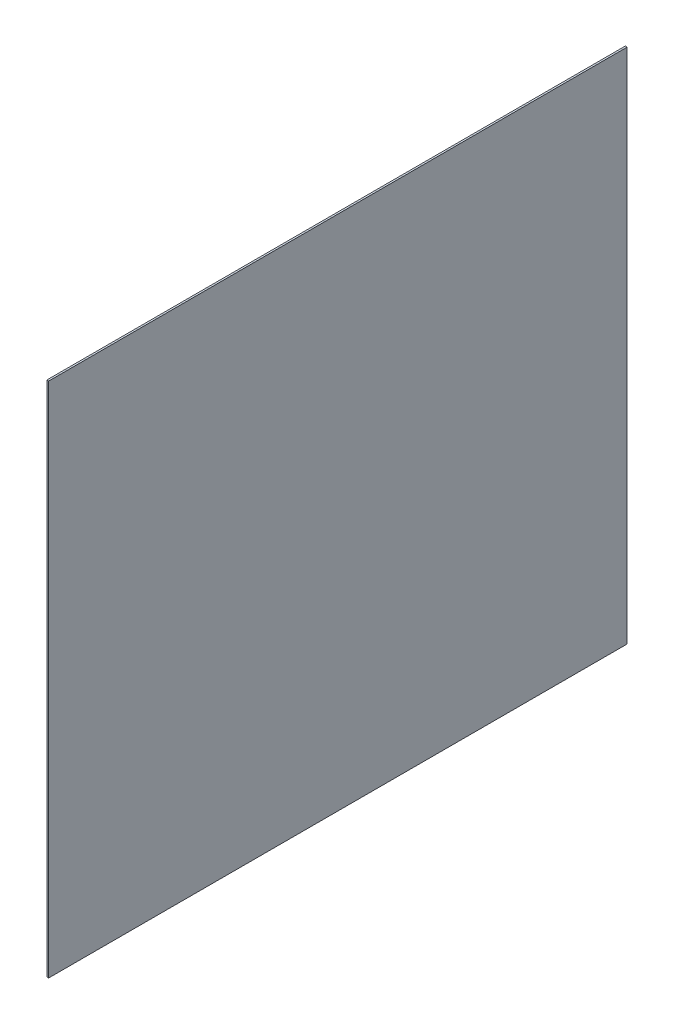
ISO-10303-21;
HEADER;
FILE_DESCRIPTION(('STEP AP214'),'2;1');
FILE_NAME('part.step','',(''),(''),'','','');
FILE_SCHEMA(('AUTOMOTIVE_DESIGN { 1 0 10303 214 1 1 1 1 }'));
ENDSEC;
DATA;
#1=APPLICATION_CONTEXT('core data for automotive mechanical design processes');
#2=APPLICATION_PROTOCOL_DEFINITION('international standard','automotive_design',2000,#1);
#3=PRODUCT_CONTEXT('',#1,'mechanical');
#4=PRODUCT('Part','Part','',(#3));
#5=PRODUCT_RELATED_PRODUCT_CATEGORY('part','',(#4));
#6=PRODUCT_DEFINITION_FORMATION('','',#4);
#7=PRODUCT_DEFINITION_CONTEXT('part definition',#1,'design');
#8=PRODUCT_DEFINITION('design','',#6,#7);
#9=PRODUCT_DEFINITION_SHAPE('','',#8);
#10=(LENGTH_UNIT() NAMED_UNIT(*) SI_UNIT(.MILLI.,.METRE.));
#11=(NAMED_UNIT(*) PLANE_ANGLE_UNIT() SI_UNIT($,.RADIAN.));
#12=(NAMED_UNIT(*) SI_UNIT($,.STERADIAN.) SOLID_ANGLE_UNIT());
#13=UNCERTAINTY_MEASURE_WITH_UNIT(LENGTH_MEASURE(1.E-05),#10,'distance_accuracy_value','');
#14=(GEOMETRIC_REPRESENTATION_CONTEXT(3) GLOBAL_UNCERTAINTY_ASSIGNED_CONTEXT((#13)) GLOBAL_UNIT_ASSIGNED_CONTEXT((#10,
#11,#12)) REPRESENTATION_CONTEXT('',''));
#15=CARTESIAN_POINT('',(0.,0.,0.));
#16=DIRECTION('',(0.,0.,1.));
#17=DIRECTION('',(1.,0.,0.));
#18=AXIS2_PLACEMENT_3D('',#15,#16,#17);
#19=CARTESIAN_POINT('',(741.,1070.,-470.));
#20=DIRECTION('',(0.,0.,1.));
#21=DIRECTION('',(0.,-1.,0.));
#22=AXIS2_PLACEMENT_3D('',#19,#20,#21);
#23=PLANE('',#22);
#24=DIRECTION('',(0.,-1.,0.));
#25=VECTOR('',#24,1.);
#26=CARTESIAN_POINT('',(744.,1070.,-470.));
#27=LINE('',#26,#25);
#28=CARTESIAN_POINT('',(744.,1070.,-470.));
#29=VERTEX_POINT('',#28);
#30=CARTESIAN_POINT('',(744.,230.,-470.));
#31=VERTEX_POINT('',#30);
#32=EDGE_CURVE('E97',#29,#31,#27,.T.);
#33=ORIENTED_EDGE('',*,*,#32,.T.);
#34=DIRECTION('',(1.,0.,0.));
#35=VECTOR('',#34,1.);
#36=CARTESIAN_POINT('',(741.,230.,-470.));
#37=LINE('',#36,#35);
#38=CARTESIAN_POINT('',(741.,230.,-470.));
#39=VERTEX_POINT('',#38);
#40=EDGE_CURVE('E11',#39,#31,#37,.T.);
#41=ORIENTED_EDGE('',*,*,#40,.F.);
#42=DIRECTION('',(0.,-1.,0.));
#43=VECTOR('',#42,1.);
#44=CARTESIAN_POINT('',(741.,1070.,-470.));
#45=LINE('',#44,#43);
#46=CARTESIAN_POINT('',(741.,1070.,-470.));
#47=VERTEX_POINT('',#46);
#48=EDGE_CURVE('E85',#47,#39,#45,.T.);
#49=ORIENTED_EDGE('',*,*,#48,.F.);
#50=DIRECTION('',(1.,0.,0.));
#51=VECTOR('',#50,1.);
#52=CARTESIAN_POINT('',(741.,1070.,-470.));
#53=LINE('',#52,#51);
#54=EDGE_CURVE('E93',#47,#29,#53,.T.);
#55=ORIENTED_EDGE('',*,*,#54,.T.);
#56=EDGE_LOOP('',(#33,#41,#49,#55));
#57=FACE_BOUND('',#56,.T.);
#58=ADVANCED_FACE('F34',(#57),#23,.F.);
#59=CARTESIAN_POINT('',(741.,230.,-470.));
#60=DIRECTION('',(0.,1.,0.));
#61=DIRECTION('',(-1.,0.,0.));
#62=AXIS2_PLACEMENT_3D('',#59,#60,#61);
#63=PLANE('',#62);
#64=DIRECTION('',(0.,0.,1.));
#65=VECTOR('',#64,1.);
#66=CARTESIAN_POINT('',(744.,230.,-470.));
#67=LINE('',#66,#65);
#68=CARTESIAN_POINT('',(744.,230.,470.));
#69=VERTEX_POINT('',#68);
#70=EDGE_CURVE('E89',#31,#69,#67,.T.);
#71=ORIENTED_EDGE('',*,*,#70,.T.);
#72=DIRECTION('',(1.,0.,0.));
#73=VECTOR('',#72,1.);
#74=CARTESIAN_POINT('',(741.,230.,470.));
#75=LINE('',#74,#73);
#76=CARTESIAN_POINT('',(741.,230.,470.));
#77=VERTEX_POINT('',#76);
#78=EDGE_CURVE('E42',#77,#69,#75,.T.);
#79=ORIENTED_EDGE('',*,*,#78,.F.);
#80=DIRECTION('',(0.,0.,1.));
#81=VECTOR('',#80,1.);
#82=CARTESIAN_POINT('',(741.,230.,-470.));
#83=LINE('',#82,#81);
#84=EDGE_CURVE('E80',#39,#77,#83,.T.);
#85=ORIENTED_EDGE('',*,*,#84,.F.);
#86=ORIENTED_EDGE('',*,*,#40,.T.);
#87=EDGE_LOOP('',(#71,#79,#85,#86));
#88=FACE_BOUND('',#87,.T.);
#89=ADVANCED_FACE('F88',(#88),#63,.F.);
#90=CARTESIAN_POINT('',(741.,1070.,470.));
#91=DIRECTION('',(0.,0.,-1.));
#92=DIRECTION('',(0.,1.,0.));
#93=AXIS2_PLACEMENT_3D('',#90,#91,#92);
#94=PLANE('',#93);
#95=DIRECTION('',(0.,1.,0.));
#96=VECTOR('',#95,1.);
#97=CARTESIAN_POINT('',(744.,1070.,470.));
#98=LINE('',#97,#96);
#99=CARTESIAN_POINT('',(744.,1070.,470.));
#100=VERTEX_POINT('',#99);
#101=EDGE_CURVE('E67',#69,#100,#98,.T.);
#102=ORIENTED_EDGE('',*,*,#101,.T.);
#103=DIRECTION('',(1.,0.,0.));
#104=VECTOR('',#103,1.);
#105=CARTESIAN_POINT('',(741.,1070.,470.));
#106=LINE('',#105,#104);
#107=CARTESIAN_POINT('',(741.,1070.,470.));
#108=VERTEX_POINT('',#107);
#109=EDGE_CURVE('E90',#108,#100,#106,.T.);
#110=ORIENTED_EDGE('',*,*,#109,.F.);
#111=DIRECTION('',(0.,1.,0.));
#112=VECTOR('',#111,1.);
#113=CARTESIAN_POINT('',(741.,1070.,470.));
#114=LINE('',#113,#112);
#115=EDGE_CURVE('E83',#77,#108,#114,.T.);
#116=ORIENTED_EDGE('',*,*,#115,.F.);
#117=ORIENTED_EDGE('',*,*,#78,.T.);
#118=EDGE_LOOP('',(#102,#110,#116,#117));
#119=FACE_BOUND('',#118,.T.);
#120=ADVANCED_FACE('F91',(#119),#94,.F.);
#121=CARTESIAN_POINT('',(741.,1070.,-470.));
#122=DIRECTION('',(0.,-1.,0.));
#123=DIRECTION('',(1.,0.,0.));
#124=AXIS2_PLACEMENT_3D('',#121,#122,#123);
#125=PLANE('',#124);
#126=DIRECTION('',(0.,0.,-1.));
#127=VECTOR('',#126,1.);
#128=CARTESIAN_POINT('',(744.,1070.,-470.));
#129=LINE('',#128,#127);
#130=EDGE_CURVE('E73',#100,#29,#129,.T.);
#131=ORIENTED_EDGE('',*,*,#130,.T.);
#132=ORIENTED_EDGE('',*,*,#54,.F.);
#133=DIRECTION('',(0.,0.,-1.));
#134=VECTOR('',#133,1.);
#135=CARTESIAN_POINT('',(741.,1070.,-470.));
#136=LINE('',#135,#134);
#137=EDGE_CURVE('E50',#108,#47,#136,.T.);
#138=ORIENTED_EDGE('',*,*,#137,.F.);
#139=ORIENTED_EDGE('',*,*,#109,.T.);
#140=EDGE_LOOP('',(#131,#132,#138,#139));
#141=FACE_BOUND('',#140,.T.);
#142=ADVANCED_FACE('F104',(#141),#125,.F.);
#143=CARTESIAN_POINT('',(741.,-1.96045512380707E-13,0.));
#144=DIRECTION('',(-1.,0.,0.));
#145=DIRECTION('',(0.,-1.,0.));
#146=AXIS2_PLACEMENT_3D('',#143,#144,#145);
#147=PLANE('',#146);
#148=ORIENTED_EDGE('',*,*,#48,.T.);
#149=ORIENTED_EDGE('',*,*,#84,.T.);
#150=ORIENTED_EDGE('',*,*,#115,.T.);
#151=ORIENTED_EDGE('',*,*,#137,.T.);
#152=EDGE_LOOP('',(#148,#149,#150,#151));
#153=FACE_BOUND('',#152,.T.);
#154=ADVANCED_FACE('F81',(#153),#147,.T.);
#155=CARTESIAN_POINT('',(744.,-1.96668078647885E-13,0.));
#156=DIRECTION('',(-1.,0.,0.));
#157=DIRECTION('',(0.,-1.,0.));
#158=AXIS2_PLACEMENT_3D('',#155,#156,#157);
#159=PLANE('',#158);
#160=ORIENTED_EDGE('',*,*,#32,.F.);
#161=ORIENTED_EDGE('',*,*,#130,.F.);
#162=ORIENTED_EDGE('',*,*,#101,.F.);
#163=ORIENTED_EDGE('',*,*,#70,.F.);
#164=EDGE_LOOP('',(#160,#161,#162,#163));
#165=FACE_BOUND('',#164,.T.);
#166=ADVANCED_FACE('F107',(#165),#159,.F.);
#167=CLOSED_SHELL('',(#58,#89,#120,#142,#154,#166));
#168=MANIFOLD_SOLID_BREP('B2',#167);
#169=ADVANCED_BREP_SHAPE_REPRESENTATION('',(#18,#168),#14);
#170=SHAPE_DEFINITION_REPRESENTATION(#9,#169);
ENDSEC;
END-ISO-10303-21;
